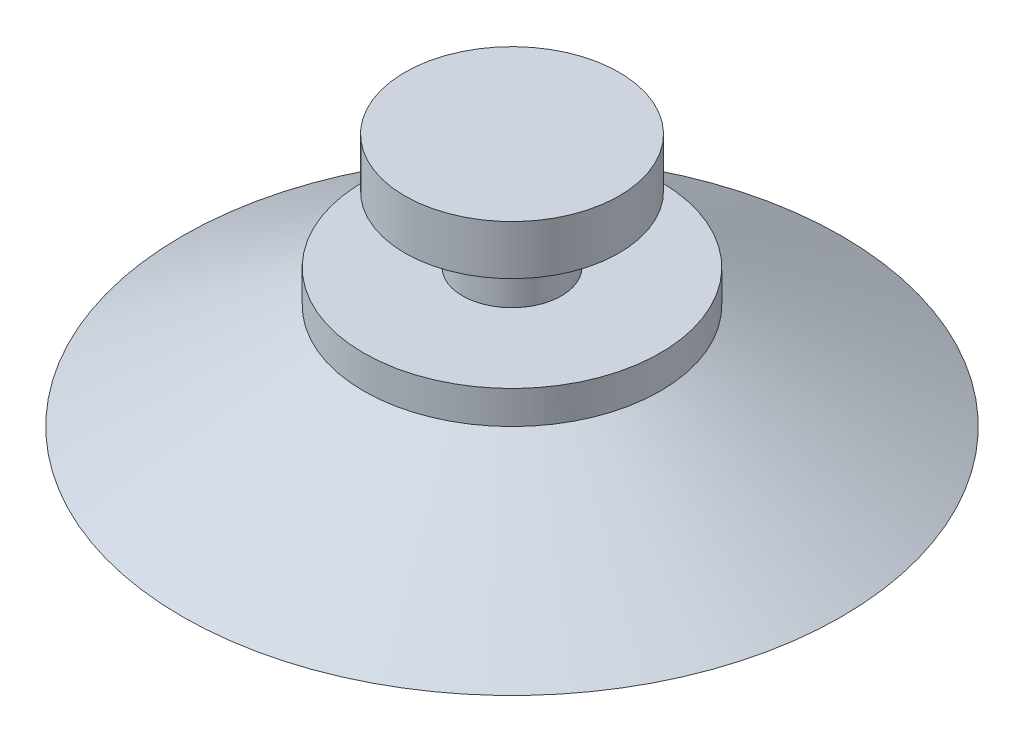
ISO-10303-21;
HEADER;
FILE_DESCRIPTION(('STEP AP214'),'2;1');
FILE_NAME('part.step','',(''),(''),'','','');
FILE_SCHEMA(('AUTOMOTIVE_DESIGN { 1 0 10303 214 1 1 1 1 }'));
ENDSEC;
DATA;
#1=APPLICATION_CONTEXT('core data for automotive mechanical design processes');
#2=APPLICATION_PROTOCOL_DEFINITION('international standard','automotive_design',2000,#1);
#3=PRODUCT_CONTEXT('',#1,'mechanical');
#4=PRODUCT('Part','Part','',(#3));
#5=PRODUCT_RELATED_PRODUCT_CATEGORY('part','',(#4));
#6=PRODUCT_DEFINITION_FORMATION('','',#4);
#7=PRODUCT_DEFINITION_CONTEXT('part definition',#1,'design');
#8=PRODUCT_DEFINITION('design','',#6,#7);
#9=PRODUCT_DEFINITION_SHAPE('','',#8);
#10=(LENGTH_UNIT() NAMED_UNIT(*) SI_UNIT(.MILLI.,.METRE.));
#11=(NAMED_UNIT(*) PLANE_ANGLE_UNIT() SI_UNIT($,.RADIAN.));
#12=(NAMED_UNIT(*) SI_UNIT($,.STERADIAN.) SOLID_ANGLE_UNIT());
#13=UNCERTAINTY_MEASURE_WITH_UNIT(LENGTH_MEASURE(1.E-05),#10,'distance_accuracy_value','');
#14=(GEOMETRIC_REPRESENTATION_CONTEXT(3) GLOBAL_UNCERTAINTY_ASSIGNED_CONTEXT((#13)) GLOBAL_UNIT_ASSIGNED_CONTEXT((#10,
#11,#12)) REPRESENTATION_CONTEXT('',''));
#15=CARTESIAN_POINT('',(0.,0.,0.));
#16=DIRECTION('',(0.,0.,1.));
#17=DIRECTION('',(1.,0.,0.));
#18=AXIS2_PLACEMENT_3D('',#15,#16,#17);
#19=CARTESIAN_POINT('',(0.,2.,0.));
#20=DIRECTION('',(0.,-1.,0.));
#21=DIRECTION('',(0.,0.,-1.));
#22=AXIS2_PLACEMENT_3D('',#19,#20,#21);
#23=CYLINDRICAL_SURFACE('',#22,1.5);
#24=CARTESIAN_POINT('',(0.,2.,0.));
#25=DIRECTION('',(0.,1.,0.));
#26=DIRECTION('',(0.,0.,1.));
#27=AXIS2_PLACEMENT_3D('',#24,#25,#26);
#28=CIRCLE('',#27,1.5);
#29=CARTESIAN_POINT('',(0.,2.,1.5));
#30=VERTEX_POINT('',#29);
#31=EDGE_CURVE('E10',#30,#30,#28,.T.);
#32=ORIENTED_EDGE('',*,*,#31,.F.);
#33=EDGE_LOOP('',(#32));
#34=FACE_BOUND('',#33,.T.);
#35=CARTESIAN_POINT('',(0.,0.,0.));
#36=DIRECTION('',(0.,1.,0.));
#37=DIRECTION('',(0.,0.,1.));
#38=AXIS2_PLACEMENT_3D('',#35,#36,#37);
#39=CIRCLE('',#38,1.5);
#40=CARTESIAN_POINT('',(0.,0.,1.5));
#41=VERTEX_POINT('',#40);
#42=EDGE_CURVE('E39',#41,#41,#39,.T.);
#43=ORIENTED_EDGE('',*,*,#42,.T.);
#44=EDGE_LOOP('',(#43));
#45=FACE_BOUND('',#44,.T.);
#46=ADVANCED_FACE('F36',(#34,#45),#23,.T.);
#47=CARTESIAN_POINT('',(0.,3.5,0.));
#48=DIRECTION('',(0.,-1.,0.));
#49=DIRECTION('',(0.,0.,-1.));
#50=AXIS2_PLACEMENT_3D('',#47,#48,#49);
#51=CYLINDRICAL_SURFACE('',#50,3.25);
#52=CARTESIAN_POINT('',(0.,3.5,0.));
#53=DIRECTION('',(0.,1.,0.));
#54=DIRECTION('',(0.,0.,1.));
#55=AXIS2_PLACEMENT_3D('',#52,#53,#54);
#56=CIRCLE('',#55,3.25);
#57=CARTESIAN_POINT('',(0.,3.5,3.25));
#58=VERTEX_POINT('',#57);
#59=EDGE_CURVE('E43',#58,#58,#56,.T.);
#60=ORIENTED_EDGE('',*,*,#59,.F.);
#61=EDGE_LOOP('',(#60));
#62=FACE_BOUND('',#61,.T.);
#63=CARTESIAN_POINT('',(0.,2.,0.));
#64=DIRECTION('',(0.,1.,0.));
#65=DIRECTION('',(0.,0.,1.));
#66=AXIS2_PLACEMENT_3D('',#63,#64,#65);
#67=CIRCLE('',#66,3.25);
#68=CARTESIAN_POINT('',(0.,2.,3.25));
#69=VERTEX_POINT('',#68);
#70=EDGE_CURVE('E47',#69,#69,#67,.T.);
#71=ORIENTED_EDGE('',*,*,#70,.T.);
#72=EDGE_LOOP('',(#71));
#73=FACE_BOUND('',#72,.T.);
#74=ADVANCED_FACE('F84',(#62,#73),#51,.T.);
#75=CARTESIAN_POINT('',(0.,3.5,0.));
#76=DIRECTION('',(0.,1.,0.));
#77=DIRECTION('',(0.,0.,1.));
#78=AXIS2_PLACEMENT_3D('',#75,#76,#77);
#79=PLANE('',#78);
#80=ORIENTED_EDGE('',*,*,#59,.T.);
#81=EDGE_LOOP('',(#80));
#82=FACE_BOUND('',#81,.T.);
#83=ADVANCED_FACE('F89',(#82),#79,.T.);
#84=CARTESIAN_POINT('',(0.,2.,0.));
#85=DIRECTION('',(0.,1.,0.));
#86=DIRECTION('',(0.,0.,1.));
#87=AXIS2_PLACEMENT_3D('',#84,#85,#86);
#88=PLANE('',#87);
#89=ORIENTED_EDGE('',*,*,#31,.T.);
#90=EDGE_LOOP('',(#89));
#91=FACE_BOUND('',#90,.T.);
#92=ORIENTED_EDGE('',*,*,#70,.F.);
#93=EDGE_LOOP('',(#92));
#94=FACE_BOUND('',#93,.T.);
#95=ADVANCED_FACE('F103',(#91,#94),#88,.F.);
#96=CARTESIAN_POINT('',(0.,-1.,0.));
#97=DIRECTION('',(0.,1.,0.));
#98=DIRECTION('',(0.,0.,1.));
#99=AXIS2_PLACEMENT_3D('',#96,#97,#98);
#100=CYLINDRICAL_SURFACE('',#99,4.5);
#101=CARTESIAN_POINT('',(0.,-1.,0.));
#102=DIRECTION('',(0.,-1.,0.));
#103=DIRECTION('',(1.,0.,0.));
#104=AXIS2_PLACEMENT_3D('',#101,#102,#103);
#105=CIRCLE('',#104,4.5);
#106=CARTESIAN_POINT('',(4.5,-0.999999999999985,0.));
#107=VERTEX_POINT('',#106);
#108=EDGE_CURVE('E55',#107,#107,#105,.T.);
#109=ORIENTED_EDGE('',*,*,#108,.F.);
#110=EDGE_LOOP('',(#109));
#111=FACE_BOUND('',#110,.T.);
#112=CARTESIAN_POINT('',(0.,0.,0.));
#113=DIRECTION('',(0.,1.,0.));
#114=DIRECTION('',(0.,0.,1.));
#115=AXIS2_PLACEMENT_3D('',#112,#113,#114);
#116=CIRCLE('',#115,4.5);
#117=CARTESIAN_POINT('',(0.,0.,4.5));
#118=VERTEX_POINT('',#117);
#119=EDGE_CURVE('E52',#118,#118,#116,.T.);
#120=ORIENTED_EDGE('',*,*,#119,.F.);
#121=EDGE_LOOP('',(#120));
#122=FACE_BOUND('',#121,.T.);
#123=ADVANCED_FACE('F98',(#111,#122),#100,.T.);
#124=CARTESIAN_POINT('',(0.,0.,0.));
#125=DIRECTION('',(0.,1.,0.));
#126=DIRECTION('',(0.,0.,1.));
#127=AXIS2_PLACEMENT_3D('',#124,#125,#126);
#128=PLANE('',#127);
#129=ORIENTED_EDGE('',*,*,#42,.F.);
#130=EDGE_LOOP('',(#129));
#131=FACE_BOUND('',#130,.T.);
#132=ORIENTED_EDGE('',*,*,#119,.T.);
#133=EDGE_LOOP('',(#132));
#134=FACE_BOUND('',#133,.T.);
#135=ADVANCED_FACE('F95',(#131,#134),#128,.T.);
#136=CARTESIAN_POINT('',(0.,-4.17542648054281,0.));
#137=DIRECTION('',(0.,-1.,0.));
#138=DIRECTION('',(1.,0.,0.));
#139=AXIS2_PLACEMENT_3D('',#136,#137,#138);
#140=CONICAL_SURFACE('',#139,9.99999999999999,1.04719755119662);
#141=ORIENTED_EDGE('',*,*,#108,.T.);
#142=EDGE_LOOP('',(#141));
#143=FACE_BOUND('',#142,.T.);
#144=CARTESIAN_POINT('',(0.,-4.17542648054281,0.));
#145=DIRECTION('',(0.,-1.,0.));
#146=DIRECTION('',(1.,0.,0.));
#147=AXIS2_PLACEMENT_3D('',#144,#145,#146);
#148=CIRCLE('',#147,9.99999999999999);
#149=CARTESIAN_POINT('',(10.,-4.17542648054278,0.));
#150=VERTEX_POINT('',#149);
#151=EDGE_CURVE('E58',#150,#150,#148,.T.);
#152=ORIENTED_EDGE('',*,*,#151,.F.);
#153=EDGE_LOOP('',(#152));
#154=FACE_BOUND('',#153,.T.);
#155=ADVANCED_FACE('F80',(#143,#154),#140,.T.);
#156=CARTESIAN_POINT('',(10.,-4.17542648054281,0.));
#157=DIRECTION('',(0.,-1.,0.));
#158=DIRECTION('',(1.,0.,0.));
#159=AXIS2_PLACEMENT_3D('',#156,#157,#158);
#160=PLANE('',#159);
#161=ORIENTED_EDGE('',*,*,#151,.T.);
#162=EDGE_LOOP('',(#161));
#163=FACE_BOUND('',#162,.T.);
#164=CARTESIAN_POINT('',(0.,-4.17542648054281,0.));
#165=DIRECTION('',(0.,-1.,0.));
#166=DIRECTION('',(1.,0.,0.));
#167=AXIS2_PLACEMENT_3D('',#164,#165,#166);
#168=CIRCLE('',#167,8.49999999999999);
#169=CARTESIAN_POINT('',(8.5,-4.17542648054278,0.));
#170=VERTEX_POINT('',#169);
#171=EDGE_CURVE('E61',#170,#170,#168,.T.);
#172=ORIENTED_EDGE('',*,*,#171,.F.);
#173=EDGE_LOOP('',(#172));
#174=FACE_BOUND('',#173,.T.);
#175=ADVANCED_FACE('F72',(#163,#174),#160,.T.);
#176=CARTESIAN_POINT('',(0.,-1.,0.));
#177=DIRECTION('',(0.,-1.,0.));
#178=DIRECTION('',(1.,0.,0.));
#179=AXIS2_PLACEMENT_3D('',#176,#177,#178);
#180=CONICAL_SURFACE('',#179,3.00000000000015,1.0471975511966);
#181=ORIENTED_EDGE('',*,*,#171,.T.);
#182=EDGE_LOOP('',(#181));
#183=FACE_BOUND('',#182,.T.);
#184=CARTESIAN_POINT('',(0.,-1.,0.));
#185=DIRECTION('',(0.,-1.,0.));
#186=DIRECTION('',(1.,0.,0.));
#187=AXIS2_PLACEMENT_3D('',#184,#185,#186);
#188=CIRCLE('',#187,3.00000000000015);
#189=CARTESIAN_POINT('',(3.00000000000015,-0.999999999999991,0.));
#190=VERTEX_POINT('',#189);
#191=EDGE_CURVE('E64',#190,#190,#188,.T.);
#192=ORIENTED_EDGE('',*,*,#191,.F.);
#193=EDGE_LOOP('',(#192));
#194=FACE_BOUND('',#193,.T.);
#195=ADVANCED_FACE('F70',(#183,#194),#180,.F.);
#196=CARTESIAN_POINT('',(0.,-1.,0.));
#197=DIRECTION('',(0.,1.,0.));
#198=DIRECTION('',(0.,0.,1.));
#199=AXIS2_PLACEMENT_3D('',#196,#197,#198);
#200=PLANE('',#199);
#201=ORIENTED_EDGE('',*,*,#191,.T.);
#202=EDGE_LOOP('',(#201));
#203=FACE_BOUND('',#202,.T.);
#204=ADVANCED_FACE('F68',(#203),#200,.F.);
#205=CLOSED_SHELL('',(#46,#74,#83,#95,#123,#135,#155,#175,#195,#204));
#206=MANIFOLD_SOLID_BREP('B2',#205);
#207=ADVANCED_BREP_SHAPE_REPRESENTATION('',(#18,#206),#14);
#208=SHAPE_DEFINITION_REPRESENTATION(#9,#207);
ENDSEC;
END-ISO-10303-21;
